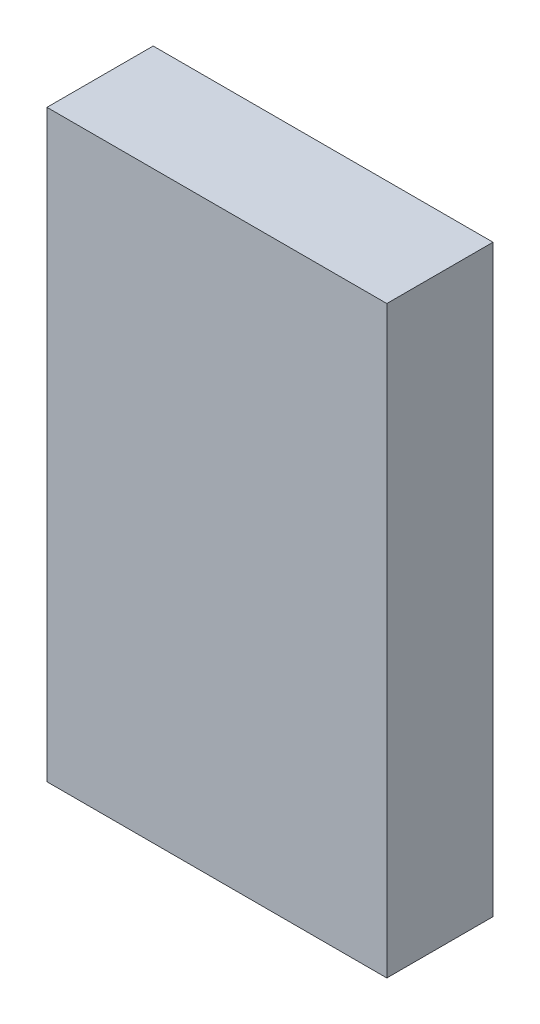
ISO-10303-21;
HEADER;
FILE_DESCRIPTION(('STEP AP214'),'2;1');
FILE_NAME('part.step','',(''),(''),'','','');
FILE_SCHEMA(('AUTOMOTIVE_DESIGN { 1 0 10303 214 1 1 1 1 }'));
ENDSEC;
DATA;
#1=APPLICATION_CONTEXT('core data for automotive mechanical design processes');
#2=APPLICATION_PROTOCOL_DEFINITION('international standard','automotive_design',2000,#1);
#3=PRODUCT_CONTEXT('',#1,'mechanical');
#4=PRODUCT('Part','Part','',(#3));
#5=PRODUCT_RELATED_PRODUCT_CATEGORY('part','',(#4));
#6=PRODUCT_DEFINITION_FORMATION('','',#4);
#7=PRODUCT_DEFINITION_CONTEXT('part definition',#1,'design');
#8=PRODUCT_DEFINITION('design','',#6,#7);
#9=PRODUCT_DEFINITION_SHAPE('','',#8);
#10=(LENGTH_UNIT() NAMED_UNIT(*) SI_UNIT(.MILLI.,.METRE.));
#11=(NAMED_UNIT(*) PLANE_ANGLE_UNIT() SI_UNIT($,.RADIAN.));
#12=(NAMED_UNIT(*) SI_UNIT($,.STERADIAN.) SOLID_ANGLE_UNIT());
#13=UNCERTAINTY_MEASURE_WITH_UNIT(LENGTH_MEASURE(1.E-05),#10,'distance_accuracy_value','');
#14=(GEOMETRIC_REPRESENTATION_CONTEXT(3) GLOBAL_UNCERTAINTY_ASSIGNED_CONTEXT((#13)) GLOBAL_UNIT_ASSIGNED_CONTEXT((#10,
#11,#12)) REPRESENTATION_CONTEXT('',''));
#15=CARTESIAN_POINT('',(0.,0.,0.));
#16=DIRECTION('',(0.,0.,1.));
#17=DIRECTION('',(1.,0.,0.));
#18=AXIS2_PLACEMENT_3D('',#15,#16,#17);
#19=CARTESIAN_POINT('',(0.,0.,10.));
#20=DIRECTION('',(1.,0.,0.));
#21=DIRECTION('',(0.,1.,0.));
#22=AXIS2_PLACEMENT_3D('',#19,#20,#21);
#23=PLANE('',#22);
#24=DIRECTION('',(0.,-1.,0.));
#25=VECTOR('',#24,1.);
#26=CARTESIAN_POINT('',(0.,0.,0.));
#27=LINE('',#26,#25);
#28=CARTESIAN_POINT('',(0.,55.,0.));
#29=VERTEX_POINT('',#28);
#30=CARTESIAN_POINT('',(0.,0.,0.));
#31=VERTEX_POINT('',#30);
#32=EDGE_CURVE('E94',#29,#31,#27,.T.);
#33=ORIENTED_EDGE('',*,*,#32,.T.);
#34=DIRECTION('',(0.,0.,-1.));
#35=VECTOR('',#34,1.);
#36=CARTESIAN_POINT('',(0.,0.,10.));
#37=LINE('',#36,#35);
#38=CARTESIAN_POINT('',(0.,0.,10.));
#39=VERTEX_POINT('',#38);
#40=EDGE_CURVE('E11',#39,#31,#37,.T.);
#41=ORIENTED_EDGE('',*,*,#40,.F.);
#42=DIRECTION('',(0.,-1.,0.));
#43=VECTOR('',#42,1.);
#44=CARTESIAN_POINT('',(0.,0.,10.));
#45=LINE('',#44,#43);
#46=CARTESIAN_POINT('',(0.,55.,10.));
#47=VERTEX_POINT('',#46);
#48=EDGE_CURVE('E82',#47,#39,#45,.T.);
#49=ORIENTED_EDGE('',*,*,#48,.F.);
#50=DIRECTION('',(0.,0.,-1.));
#51=VECTOR('',#50,1.);
#52=CARTESIAN_POINT('',(0.,55.,10.));
#53=LINE('',#52,#51);
#54=EDGE_CURVE('E90',#47,#29,#53,.T.);
#55=ORIENTED_EDGE('',*,*,#54,.T.);
#56=EDGE_LOOP('',(#33,#41,#49,#55));
#57=FACE_BOUND('',#56,.T.);
#58=ADVANCED_FACE('F31',(#57),#23,.F.);
#59=CARTESIAN_POINT('',(0.,0.,10.));
#60=DIRECTION('',(0.,1.,0.));
#61=DIRECTION('',(0.,0.,1.));
#62=AXIS2_PLACEMENT_3D('',#59,#60,#61);
#63=PLANE('',#62);
#64=DIRECTION('',(1.,0.,0.));
#65=VECTOR('',#64,1.);
#66=CARTESIAN_POINT('',(0.,0.,0.));
#67=LINE('',#66,#65);
#68=CARTESIAN_POINT('',(32.,0.,0.));
#69=VERTEX_POINT('',#68);
#70=EDGE_CURVE('E86',#31,#69,#67,.T.);
#71=ORIENTED_EDGE('',*,*,#70,.T.);
#72=DIRECTION('',(0.,0.,-1.));
#73=VECTOR('',#72,1.);
#74=CARTESIAN_POINT('',(32.,0.,10.));
#75=LINE('',#74,#73);
#76=CARTESIAN_POINT('',(32.,0.,10.));
#77=VERTEX_POINT('',#76);
#78=EDGE_CURVE('E39',#77,#69,#75,.T.);
#79=ORIENTED_EDGE('',*,*,#78,.F.);
#80=DIRECTION('',(1.,0.,0.));
#81=VECTOR('',#80,1.);
#82=CARTESIAN_POINT('',(0.,0.,10.));
#83=LINE('',#82,#81);
#84=EDGE_CURVE('E77',#39,#77,#83,.T.);
#85=ORIENTED_EDGE('',*,*,#84,.F.);
#86=ORIENTED_EDGE('',*,*,#40,.T.);
#87=EDGE_LOOP('',(#71,#79,#85,#86));
#88=FACE_BOUND('',#87,.T.);
#89=ADVANCED_FACE('F85',(#88),#63,.F.);
#90=CARTESIAN_POINT('',(32.,0.,10.));
#91=DIRECTION('',(-1.,0.,0.));
#92=DIRECTION('',(0.,-1.,0.));
#93=AXIS2_PLACEMENT_3D('',#90,#91,#92);
#94=PLANE('',#93);
#95=DIRECTION('',(0.,1.,0.));
#96=VECTOR('',#95,1.);
#97=CARTESIAN_POINT('',(32.,0.,0.));
#98=LINE('',#97,#96);
#99=CARTESIAN_POINT('',(32.,55.,0.));
#100=VERTEX_POINT('',#99);
#101=EDGE_CURVE('E64',#69,#100,#98,.T.);
#102=ORIENTED_EDGE('',*,*,#101,.T.);
#103=DIRECTION('',(0.,0.,-1.));
#104=VECTOR('',#103,1.);
#105=CARTESIAN_POINT('',(32.,55.,10.));
#106=LINE('',#105,#104);
#107=CARTESIAN_POINT('',(32.,55.,10.));
#108=VERTEX_POINT('',#107);
#109=EDGE_CURVE('E87',#108,#100,#106,.T.);
#110=ORIENTED_EDGE('',*,*,#109,.F.);
#111=DIRECTION('',(0.,1.,0.));
#112=VECTOR('',#111,1.);
#113=CARTESIAN_POINT('',(32.,0.,10.));
#114=LINE('',#113,#112);
#115=EDGE_CURVE('E80',#77,#108,#114,.T.);
#116=ORIENTED_EDGE('',*,*,#115,.F.);
#117=ORIENTED_EDGE('',*,*,#78,.T.);
#118=EDGE_LOOP('',(#102,#110,#116,#117));
#119=FACE_BOUND('',#118,.T.);
#120=ADVANCED_FACE('F88',(#119),#94,.F.);
#121=CARTESIAN_POINT('',(0.,55.,10.));
#122=DIRECTION('',(0.,-1.,0.));
#123=DIRECTION('',(0.,0.,-1.));
#124=AXIS2_PLACEMENT_3D('',#121,#122,#123);
#125=PLANE('',#124);
#126=DIRECTION('',(-1.,0.,0.));
#127=VECTOR('',#126,1.);
#128=CARTESIAN_POINT('',(0.,55.,0.));
#129=LINE('',#128,#127);
#130=EDGE_CURVE('E70',#100,#29,#129,.T.);
#131=ORIENTED_EDGE('',*,*,#130,.T.);
#132=ORIENTED_EDGE('',*,*,#54,.F.);
#133=DIRECTION('',(-1.,0.,0.));
#134=VECTOR('',#133,1.);
#135=CARTESIAN_POINT('',(0.,55.,10.));
#136=LINE('',#135,#134);
#137=EDGE_CURVE('E47',#108,#47,#136,.T.);
#138=ORIENTED_EDGE('',*,*,#137,.F.);
#139=ORIENTED_EDGE('',*,*,#109,.T.);
#140=EDGE_LOOP('',(#131,#132,#138,#139));
#141=FACE_BOUND('',#140,.T.);
#142=ADVANCED_FACE('F101',(#141),#125,.F.);
#143=CARTESIAN_POINT('',(0.,55.,10.));
#144=DIRECTION('',(0.,0.,-1.));
#145=DIRECTION('',(-1.,0.,0.));
#146=AXIS2_PLACEMENT_3D('',#143,#144,#145);
#147=PLANE('',#146);
#148=ORIENTED_EDGE('',*,*,#48,.T.);
#149=ORIENTED_EDGE('',*,*,#84,.T.);
#150=ORIENTED_EDGE('',*,*,#115,.T.);
#151=ORIENTED_EDGE('',*,*,#137,.T.);
#152=EDGE_LOOP('',(#148,#149,#150,#151));
#153=FACE_BOUND('',#152,.T.);
#154=ADVANCED_FACE('F78',(#153),#147,.F.);
#155=CARTESIAN_POINT('',(0.,55.,0.));
#156=DIRECTION('',(0.,0.,-1.));
#157=DIRECTION('',(-1.,0.,0.));
#158=AXIS2_PLACEMENT_3D('',#155,#156,#157);
#159=PLANE('',#158);
#160=ORIENTED_EDGE('',*,*,#32,.F.);
#161=ORIENTED_EDGE('',*,*,#130,.F.);
#162=ORIENTED_EDGE('',*,*,#101,.F.);
#163=ORIENTED_EDGE('',*,*,#70,.F.);
#164=EDGE_LOOP('',(#160,#161,#162,#163));
#165=FACE_BOUND('',#164,.T.);
#166=ADVANCED_FACE('F104',(#165),#159,.T.);
#167=CLOSED_SHELL('',(#58,#89,#120,#142,#154,#166));
#168=MANIFOLD_SOLID_BREP('B2',#167);
#169=ADVANCED_BREP_SHAPE_REPRESENTATION('',(#18,#168),#14);
#170=SHAPE_DEFINITION_REPRESENTATION(#9,#169);
ENDSEC;
END-ISO-10303-21;
